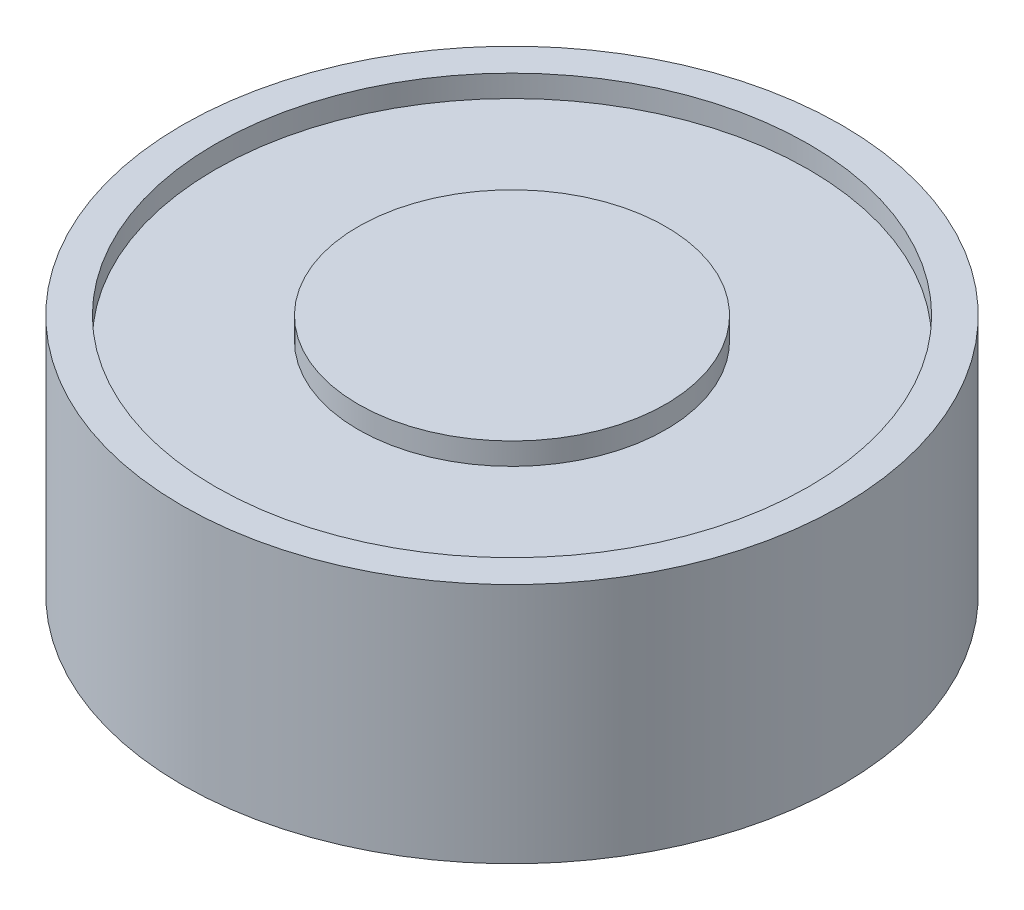
ISO-10303-21;
HEADER;
FILE_DESCRIPTION(('STEP AP214'),'2;1');
FILE_NAME('part.step','',(''),(''),'','','');
FILE_SCHEMA(('AUTOMOTIVE_DESIGN { 1 0 10303 214 1 1 1 1 }'));
ENDSEC;
DATA;
#1=APPLICATION_CONTEXT('core data for automotive mechanical design processes');
#2=APPLICATION_PROTOCOL_DEFINITION('international standard','automotive_design',2000,#1);
#3=PRODUCT_CONTEXT('',#1,'mechanical');
#4=PRODUCT('Part','Part','',(#3));
#5=PRODUCT_RELATED_PRODUCT_CATEGORY('part','',(#4));
#6=PRODUCT_DEFINITION_FORMATION('','',#4);
#7=PRODUCT_DEFINITION_CONTEXT('part definition',#1,'design');
#8=PRODUCT_DEFINITION('design','',#6,#7);
#9=PRODUCT_DEFINITION_SHAPE('','',#8);
#10=(LENGTH_UNIT() NAMED_UNIT(*) SI_UNIT(.MILLI.,.METRE.));
#11=(NAMED_UNIT(*) PLANE_ANGLE_UNIT() SI_UNIT($,.RADIAN.));
#12=(NAMED_UNIT(*) SI_UNIT($,.STERADIAN.) SOLID_ANGLE_UNIT());
#13=UNCERTAINTY_MEASURE_WITH_UNIT(LENGTH_MEASURE(1.E-05),#10,'distance_accuracy_value','');
#14=(GEOMETRIC_REPRESENTATION_CONTEXT(3) GLOBAL_UNCERTAINTY_ASSIGNED_CONTEXT((#13)) GLOBAL_UNIT_ASSIGNED_CONTEXT((#10,
#11,#12)) REPRESENTATION_CONTEXT('',''));
#15=CARTESIAN_POINT('',(0.,0.,0.));
#16=DIRECTION('',(0.,0.,1.));
#17=DIRECTION('',(1.,0.,0.));
#18=AXIS2_PLACEMENT_3D('',#15,#16,#17);
#19=CARTESIAN_POINT('',(0.,22.,0.));
#20=DIRECTION('',(0.,-1.,0.));
#21=DIRECTION('',(0.,0.,-1.));
#22=AXIS2_PLACEMENT_3D('',#19,#20,#21);
#23=CYLINDRICAL_SURFACE('',#22,30.);
#24=CARTESIAN_POINT('',(0.,22.,0.));
#25=DIRECTION('',(0.,1.,0.));
#26=DIRECTION('',(0.,0.,1.));
#27=AXIS2_PLACEMENT_3D('',#24,#25,#26);
#28=CIRCLE('',#27,30.);
#29=CARTESIAN_POINT('',(0.,22.,30.));
#30=VERTEX_POINT('',#29);
#31=EDGE_CURVE('E11',#30,#30,#28,.T.);
#32=ORIENTED_EDGE('',*,*,#31,.F.);
#33=EDGE_LOOP('',(#32));
#34=FACE_BOUND('',#33,.T.);
#35=CARTESIAN_POINT('',(0.,0.,0.));
#36=DIRECTION('',(0.,1.,0.));
#37=DIRECTION('',(0.,0.,1.));
#38=AXIS2_PLACEMENT_3D('',#35,#36,#37);
#39=CIRCLE('',#38,30.);
#40=CARTESIAN_POINT('',(0.,0.,30.));
#41=VERTEX_POINT('',#40);
#42=EDGE_CURVE('E46',#41,#41,#39,.T.);
#43=ORIENTED_EDGE('',*,*,#42,.T.);
#44=EDGE_LOOP('',(#43));
#45=FACE_BOUND('',#44,.T.);
#46=ADVANCED_FACE('F43',(#34,#45),#23,.T.);
#47=CARTESIAN_POINT('',(0.,22.,0.));
#48=DIRECTION('',(0.,1.,0.));
#49=DIRECTION('',(0.,0.,1.));
#50=AXIS2_PLACEMENT_3D('',#47,#48,#49);
#51=PLANE('',#50);
#52=CARTESIAN_POINT('',(0.,22.,0.));
#53=DIRECTION('',(0.,1.,0.));
#54=DIRECTION('',(0.,0.,1.));
#55=AXIS2_PLACEMENT_3D('',#52,#53,#54);
#56=CIRCLE('',#55,27.);
#57=CARTESIAN_POINT('',(0.,22.,27.));
#58=VERTEX_POINT('',#57);
#59=EDGE_CURVE('E72',#58,#58,#56,.T.);
#60=ORIENTED_EDGE('',*,*,#59,.F.);
#61=EDGE_LOOP('',(#60));
#62=FACE_BOUND('',#61,.T.);
#63=ORIENTED_EDGE('',*,*,#31,.T.);
#64=EDGE_LOOP('',(#63));
#65=FACE_BOUND('',#64,.T.);
#66=ADVANCED_FACE('F82',(#62,#65),#51,.T.);
#67=CARTESIAN_POINT('',(0.,0.,0.));
#68=DIRECTION('',(0.,1.,0.));
#69=DIRECTION('',(0.,0.,1.));
#70=AXIS2_PLACEMENT_3D('',#67,#68,#69);
#71=PLANE('',#70);
#72=CARTESIAN_POINT('',(0.,0.,0.));
#73=DIRECTION('',(0.,-1.,0.));
#74=DIRECTION('',(0.,0.,-1.));
#75=AXIS2_PLACEMENT_3D('',#72,#73,#74);
#76=CIRCLE('',#75,1.69999999999999);
#77=CARTESIAN_POINT('',(0.,0.,-1.69999999999999));
#78=VERTEX_POINT('',#77);
#79=EDGE_CURVE('E63',#78,#78,#76,.T.);
#80=ORIENTED_EDGE('',*,*,#79,.F.);
#81=EDGE_LOOP('',(#80));
#82=FACE_BOUND('',#81,.T.);
#83=ORIENTED_EDGE('',*,*,#42,.F.);
#84=EDGE_LOOP('',(#83));
#85=FACE_BOUND('',#84,.T.);
#86=ADVANCED_FACE('F85',(#82,#85),#71,.F.);
#87=CARTESIAN_POINT('',(0.,20.,0.));
#88=DIRECTION('',(0.,1.,0.));
#89=DIRECTION('',(0.,0.,1.));
#90=AXIS2_PLACEMENT_3D('',#87,#88,#89);
#91=CYLINDRICAL_SURFACE('',#90,27.);
#92=CARTESIAN_POINT('',(0.,20.,0.));
#93=DIRECTION('',(0.,1.,0.));
#94=DIRECTION('',(0.,0.,1.));
#95=AXIS2_PLACEMENT_3D('',#92,#93,#94);
#96=CIRCLE('',#95,27.);
#97=CARTESIAN_POINT('',(0.,20.,27.));
#98=VERTEX_POINT('',#97);
#99=EDGE_CURVE('E74',#98,#98,#96,.T.);
#100=ORIENTED_EDGE('',*,*,#99,.F.);
#101=EDGE_LOOP('',(#100));
#102=FACE_BOUND('',#101,.T.);
#103=ORIENTED_EDGE('',*,*,#59,.T.);
#104=EDGE_LOOP('',(#103));
#105=FACE_BOUND('',#104,.T.);
#106=ADVANCED_FACE('F80',(#102,#105),#91,.F.);
#107=CARTESIAN_POINT('',(0.,20.,0.));
#108=DIRECTION('',(0.,1.,0.));
#109=DIRECTION('',(0.,0.,1.));
#110=AXIS2_PLACEMENT_3D('',#107,#108,#109);
#111=PLANE('',#110);
#112=CARTESIAN_POINT('',(0.,20.,0.));
#113=DIRECTION('',(0.,1.,0.));
#114=DIRECTION('',(0.,0.,1.));
#115=AXIS2_PLACEMENT_3D('',#112,#113,#114);
#116=CIRCLE('',#115,14.);
#117=CARTESIAN_POINT('',(0.,20.,14.));
#118=VERTEX_POINT('',#117);
#119=EDGE_CURVE('E62',#118,#118,#116,.T.);
#120=ORIENTED_EDGE('',*,*,#119,.F.);
#121=EDGE_LOOP('',(#120));
#122=FACE_BOUND('',#121,.T.);
#123=ORIENTED_EDGE('',*,*,#99,.T.);
#124=EDGE_LOOP('',(#123));
#125=FACE_BOUND('',#124,.T.);
#126=ADVANCED_FACE('F100',(#122,#125),#111,.T.);
#127=CARTESIAN_POINT('',(0.,22.,0.));
#128=DIRECTION('',(0.,-1.,0.));
#129=DIRECTION('',(0.,0.,-1.));
#130=AXIS2_PLACEMENT_3D('',#127,#128,#129);
#131=CYLINDRICAL_SURFACE('',#130,14.);
#132=CARTESIAN_POINT('',(0.,22.,0.));
#133=DIRECTION('',(0.,1.,0.));
#134=DIRECTION('',(0.,0.,1.));
#135=AXIS2_PLACEMENT_3D('',#132,#133,#134);
#136=CIRCLE('',#135,14.);
#137=CARTESIAN_POINT('',(0.,22.,14.));
#138=VERTEX_POINT('',#137);
#139=EDGE_CURVE('E66',#138,#138,#136,.T.);
#140=ORIENTED_EDGE('',*,*,#139,.F.);
#141=EDGE_LOOP('',(#140));
#142=FACE_BOUND('',#141,.T.);
#143=ORIENTED_EDGE('',*,*,#119,.T.);
#144=EDGE_LOOP('',(#143));
#145=FACE_BOUND('',#144,.T.);
#146=ADVANCED_FACE('F107',(#142,#145),#131,.T.);
#147=CARTESIAN_POINT('',(0.,22.,0.));
#148=DIRECTION('',(0.,1.,0.));
#149=DIRECTION('',(0.,0.,1.));
#150=AXIS2_PLACEMENT_3D('',#147,#148,#149);
#151=PLANE('',#150);
#152=ORIENTED_EDGE('',*,*,#139,.T.);
#153=EDGE_LOOP('',(#152));
#154=FACE_BOUND('',#153,.T.);
#155=ADVANCED_FACE('F56',(#154),#151,.T.);
#156=CARTESIAN_POINT('',(0.,7.,0.));
#157=DIRECTION('',(0.,-1.,0.));
#158=DIRECTION('',(0.,0.,-1.));
#159=AXIS2_PLACEMENT_3D('',#156,#157,#158);
#160=CONICAL_SURFACE('',#159,1.7,1.02974425867665);
#161=CARTESIAN_POINT('',(0.,8.02146305234685,0.));
#162=VERTEX_POINT('',#161);
#163=VERTEX_LOOP('',#162);
#164=FACE_BOUND('',#163,.T.);
#165=CARTESIAN_POINT('',(0.,7.,0.));
#166=DIRECTION('',(0.,-1.,0.));
#167=DIRECTION('',(0.,0.,-1.));
#168=AXIS2_PLACEMENT_3D('',#165,#166,#167);
#169=CIRCLE('',#168,1.7);
#170=CARTESIAN_POINT('',(0.,7.,-1.7));
#171=VERTEX_POINT('',#170);
#172=EDGE_CURVE('E60',#171,#171,#169,.T.);
#173=ORIENTED_EDGE('',*,*,#172,.T.);
#174=EDGE_LOOP('',(#173));
#175=FACE_BOUND('',#174,.T.);
#176=ADVANCED_FACE('F52',(#164,#175),#160,.F.);
#177=CARTESIAN_POINT('',(0.,0.,0.));
#178=DIRECTION('',(0.,-1.,0.));
#179=DIRECTION('',(0.,0.,-1.));
#180=AXIS2_PLACEMENT_3D('',#177,#178,#179);
#181=CYLINDRICAL_SURFACE('',#180,1.69999999999999);
#182=ORIENTED_EDGE('',*,*,#172,.F.);
#183=EDGE_LOOP('',(#182));
#184=FACE_BOUND('',#183,.T.);
#185=ORIENTED_EDGE('',*,*,#79,.T.);
#186=EDGE_LOOP('',(#185));
#187=FACE_BOUND('',#186,.T.);
#188=ADVANCED_FACE('F55',(#184,#187),#181,.F.);
#189=CLOSED_SHELL('',(#46,#66,#86,#106,#126,#146,#155,#176,#188));
#190=MANIFOLD_SOLID_BREP('B2',#189);
#191=ADVANCED_BREP_SHAPE_REPRESENTATION('',(#18,#190),#14);
#192=SHAPE_DEFINITION_REPRESENTATION(#9,#191);
ENDSEC;
END-ISO-10303-21;
